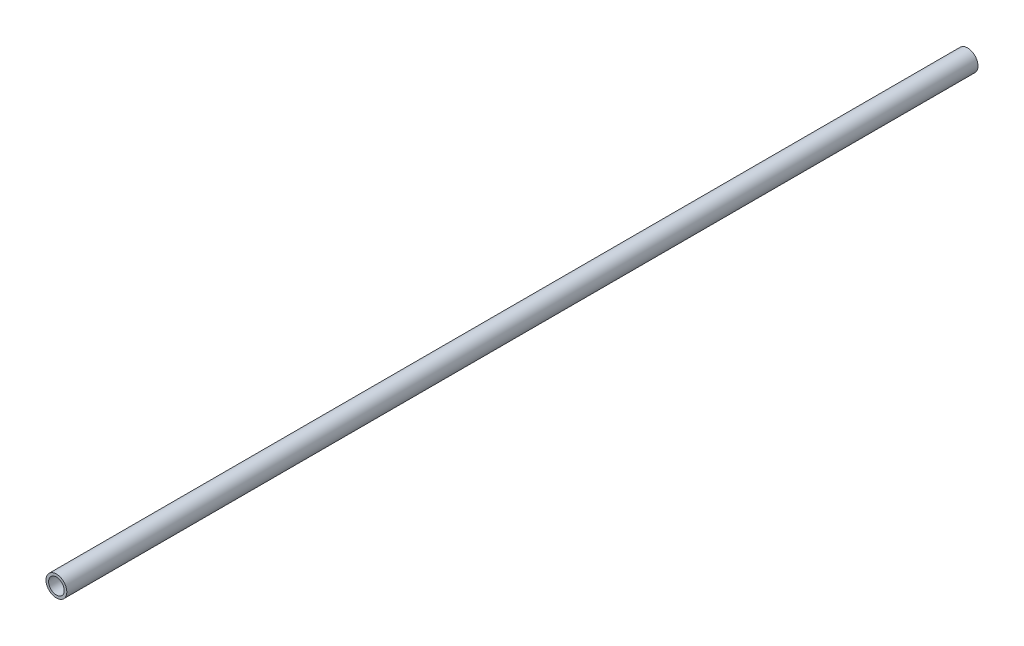
ISO-10303-21;
HEADER;
FILE_DESCRIPTION(('STEP AP214'),'2;1');
FILE_NAME('part.step','',(''),(''),'','','');
FILE_SCHEMA(('AUTOMOTIVE_DESIGN { 1 0 10303 214 1 1 1 1 }'));
ENDSEC;
DATA;
#1=APPLICATION_CONTEXT('core data for automotive mechanical design processes');
#2=APPLICATION_PROTOCOL_DEFINITION('international standard','automotive_design',2000,#1);
#3=PRODUCT_CONTEXT('',#1,'mechanical');
#4=PRODUCT('Part','Part','',(#3));
#5=PRODUCT_RELATED_PRODUCT_CATEGORY('part','',(#4));
#6=PRODUCT_DEFINITION_FORMATION('','',#4);
#7=PRODUCT_DEFINITION_CONTEXT('part definition',#1,'design');
#8=PRODUCT_DEFINITION('design','',#6,#7);
#9=PRODUCT_DEFINITION_SHAPE('','',#8);
#10=(LENGTH_UNIT() NAMED_UNIT(*) SI_UNIT(.MILLI.,.METRE.));
#11=(NAMED_UNIT(*) PLANE_ANGLE_UNIT() SI_UNIT($,.RADIAN.));
#12=(NAMED_UNIT(*) SI_UNIT($,.STERADIAN.) SOLID_ANGLE_UNIT());
#13=UNCERTAINTY_MEASURE_WITH_UNIT(LENGTH_MEASURE(1.E-05),#10,'distance_accuracy_value','');
#14=(GEOMETRIC_REPRESENTATION_CONTEXT(3) GLOBAL_UNCERTAINTY_ASSIGNED_CONTEXT((#13)) GLOBAL_UNIT_ASSIGNED_CONTEXT((#10,
#11,#12)) REPRESENTATION_CONTEXT('',''));
#15=CARTESIAN_POINT('',(0.,0.,0.));
#16=DIRECTION('',(0.,0.,1.));
#17=DIRECTION('',(1.,0.,0.));
#18=AXIS2_PLACEMENT_3D('',#15,#16,#17);
#19=CARTESIAN_POINT('',(0.,0.,350.));
#20=DIRECTION('',(0.,0.,1.));
#21=DIRECTION('',(1.,0.,0.));
#22=AXIS2_PLACEMENT_3D('',#19,#20,#21);
#23=PLANE('',#22);
#24=CARTESIAN_POINT('',(0.,0.,350.));
#25=DIRECTION('',(0.,0.,1.));
#26=DIRECTION('',(1.,0.,0.));
#27=AXIS2_PLACEMENT_3D('',#24,#25,#26);
#28=CIRCLE('',#27,4.);
#29=CARTESIAN_POINT('',(4.,0.,350.));
#30=VERTEX_POINT('',#29);
#31=EDGE_CURVE('E11',#30,#30,#28,.T.);
#32=ORIENTED_EDGE('',*,*,#31,.T.);
#33=EDGE_LOOP('',(#32));
#34=FACE_BOUND('',#33,.T.);
#35=CARTESIAN_POINT('',(0.,0.,350.));
#36=DIRECTION('',(0.,0.,1.));
#37=DIRECTION('',(1.,0.,0.));
#38=AXIS2_PLACEMENT_3D('',#35,#36,#37);
#39=CIRCLE('',#38,3.);
#40=CARTESIAN_POINT('',(3.,0.,350.));
#41=VERTEX_POINT('',#40);
#42=EDGE_CURVE('E48',#41,#41,#39,.T.);
#43=ORIENTED_EDGE('',*,*,#42,.F.);
#44=EDGE_LOOP('',(#43));
#45=FACE_BOUND('',#44,.T.);
#46=ADVANCED_FACE('F37',(#34,#45),#23,.T.);
#47=CARTESIAN_POINT('',(0.,0.,0.));
#48=DIRECTION('',(0.,0.,1.));
#49=DIRECTION('',(1.,0.,0.));
#50=AXIS2_PLACEMENT_3D('',#47,#48,#49);
#51=PLANE('',#50);
#52=CARTESIAN_POINT('',(0.,0.,0.));
#53=DIRECTION('',(0.,0.,1.));
#54=DIRECTION('',(1.,0.,0.));
#55=AXIS2_PLACEMENT_3D('',#52,#53,#54);
#56=CIRCLE('',#55,4.);
#57=CARTESIAN_POINT('',(4.,0.,0.));
#58=VERTEX_POINT('',#57);
#59=EDGE_CURVE('E41',#58,#58,#56,.T.);
#60=ORIENTED_EDGE('',*,*,#59,.F.);
#61=EDGE_LOOP('',(#60));
#62=FACE_BOUND('',#61,.T.);
#63=CARTESIAN_POINT('',(0.,0.,0.));
#64=DIRECTION('',(0.,0.,1.));
#65=DIRECTION('',(1.,0.,0.));
#66=AXIS2_PLACEMENT_3D('',#63,#64,#65);
#67=CIRCLE('',#66,3.);
#68=CARTESIAN_POINT('',(3.,0.,0.));
#69=VERTEX_POINT('',#68);
#70=EDGE_CURVE('E50',#69,#69,#67,.T.);
#71=ORIENTED_EDGE('',*,*,#70,.T.);
#72=EDGE_LOOP('',(#71));
#73=FACE_BOUND('',#72,.T.);
#74=ADVANCED_FACE('F60',(#62,#73),#51,.F.);
#75=CARTESIAN_POINT('',(0.,0.,350.));
#76=DIRECTION('',(0.,0.,-1.));
#77=DIRECTION('',(-1.,0.,0.));
#78=AXIS2_PLACEMENT_3D('',#75,#76,#77);
#79=CYLINDRICAL_SURFACE('',#78,4.);
#80=ORIENTED_EDGE('',*,*,#31,.F.);
#81=EDGE_LOOP('',(#80));
#82=FACE_BOUND('',#81,.T.);
#83=ORIENTED_EDGE('',*,*,#59,.T.);
#84=EDGE_LOOP('',(#83));
#85=FACE_BOUND('',#84,.T.);
#86=ADVANCED_FACE('F39',(#82,#85),#79,.T.);
#87=CARTESIAN_POINT('',(0.,0.,350.));
#88=DIRECTION('',(0.,0.,-1.));
#89=DIRECTION('',(-1.,0.,0.));
#90=AXIS2_PLACEMENT_3D('',#87,#88,#89);
#91=CYLINDRICAL_SURFACE('',#90,3.);
#92=ORIENTED_EDGE('',*,*,#42,.T.);
#93=EDGE_LOOP('',(#92));
#94=FACE_BOUND('',#93,.T.);
#95=ORIENTED_EDGE('',*,*,#70,.F.);
#96=EDGE_LOOP('',(#95));
#97=FACE_BOUND('',#96,.T.);
#98=ADVANCED_FACE('F56',(#94,#97),#91,.F.);
#99=CLOSED_SHELL('',(#46,#74,#86,#98));
#100=MANIFOLD_SOLID_BREP('B2',#99);
#101=ADVANCED_BREP_SHAPE_REPRESENTATION('',(#18,#100),#14);
#102=SHAPE_DEFINITION_REPRESENTATION(#9,#101);
ENDSEC;
END-ISO-10303-21;
